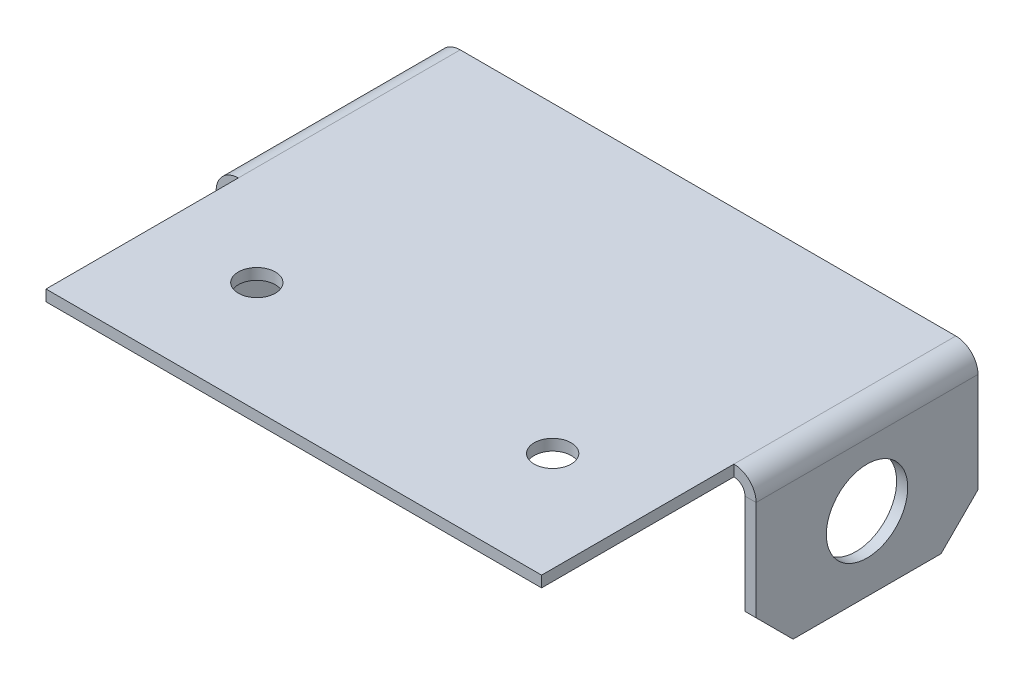
ISO-10303-21;
HEADER;
FILE_DESCRIPTION(('STEP AP214'),'2;1');
FILE_NAME('part.step','',(''),(''),'','','');
FILE_SCHEMA(('AUTOMOTIVE_DESIGN { 1 0 10303 214 1 1 1 1 }'));
ENDSEC;
DATA;
#1=APPLICATION_CONTEXT('core data for automotive mechanical design processes');
#2=APPLICATION_PROTOCOL_DEFINITION('international standard','automotive_design',2000,#1);
#3=PRODUCT_CONTEXT('',#1,'mechanical');
#4=PRODUCT('Part','Part','',(#3));
#5=PRODUCT_RELATED_PRODUCT_CATEGORY('part','',(#4));
#6=PRODUCT_DEFINITION_FORMATION('','',#4);
#7=PRODUCT_DEFINITION_CONTEXT('part definition',#1,'design');
#8=PRODUCT_DEFINITION('design','',#6,#7);
#9=PRODUCT_DEFINITION_SHAPE('','',#8);
#10=(LENGTH_UNIT() NAMED_UNIT(*) SI_UNIT(.MILLI.,.METRE.));
#11=(NAMED_UNIT(*) PLANE_ANGLE_UNIT() SI_UNIT($,.RADIAN.));
#12=(NAMED_UNIT(*) SI_UNIT($,.STERADIAN.) SOLID_ANGLE_UNIT());
#13=UNCERTAINTY_MEASURE_WITH_UNIT(LENGTH_MEASURE(1.E-05),#10,'distance_accuracy_value','');
#14=(GEOMETRIC_REPRESENTATION_CONTEXT(3) GLOBAL_UNCERTAINTY_ASSIGNED_CONTEXT((#13)) GLOBAL_UNIT_ASSIGNED_CONTEXT((#10,
#11,#12)) REPRESENTATION_CONTEXT('',''));
#15=CARTESIAN_POINT('',(0.,0.,0.));
#16=DIRECTION('',(0.,0.,1.));
#17=DIRECTION('',(1.,0.,0.));
#18=AXIS2_PLACEMENT_3D('',#15,#16,#17);
#19=CARTESIAN_POINT('',(33.5,0.,15.));
#20=DIRECTION('',(0.,0.,1.));
#21=DIRECTION('',(1.,0.,0.));
#22=AXIS2_PLACEMENT_3D('',#19,#20,#21);
#23=PLANE('',#22);
#24=DIRECTION('',(0.,1.,0.));
#25=VECTOR('',#24,1.);
#26=CARTESIAN_POINT('',(33.5,0.,15.));
#27=LINE('',#26,#25);
#28=CARTESIAN_POINT('',(33.5,0.,15.));
#29=VERTEX_POINT('',#28);
#30=CARTESIAN_POINT('',(33.5,1.5,15.));
#31=VERTEX_POINT('',#30);
#32=EDGE_CURVE('E313',#29,#31,#27,.T.);
#33=ORIENTED_EDGE('',*,*,#32,.F.);
#34=CARTESIAN_POINT('',(33.5,-1.5,15.));
#35=DIRECTION('',(0.,0.,-1.));
#36=DIRECTION('',(-1.,0.,0.));
#37=AXIS2_PLACEMENT_3D('',#34,#35,#36);
#38=CIRCLE('',#37,1.5);
#39=CARTESIAN_POINT('',(35.,-1.5,15.));
#40=VERTEX_POINT('',#39);
#41=EDGE_CURVE('E227',#40,#29,#38,.F.);
#42=ORIENTED_EDGE('',*,*,#41,.F.);
#43=DIRECTION('',(-1.,0.,0.));
#44=VECTOR('',#43,1.);
#45=CARTESIAN_POINT('',(36.5,-1.5,15.));
#46=LINE('',#45,#44);
#47=CARTESIAN_POINT('',(36.5,-1.5,15.));
#48=VERTEX_POINT('',#47);
#49=EDGE_CURVE('E310',#48,#40,#46,.T.);
#50=ORIENTED_EDGE('',*,*,#49,.F.);
#51=CARTESIAN_POINT('',(33.5,-1.5,15.));
#52=DIRECTION('',(0.,0.,1.));
#53=DIRECTION('',(1.,0.,0.));
#54=AXIS2_PLACEMENT_3D('',#51,#52,#53);
#55=CIRCLE('',#54,3.);
#56=EDGE_CURVE('E234',#48,#31,#55,.T.);
#57=ORIENTED_EDGE('',*,*,#56,.T.);
#58=EDGE_LOOP('',(#33,#42,#50,#57));
#59=FACE_BOUND('',#58,.T.);
#60=ADVANCED_FACE('F43',(#59),#23,.T.);
#61=CARTESIAN_POINT('',(35.,-1.5,-15.));
#62=DIRECTION('',(0.,0.,-1.));
#63=DIRECTION('',(-1.,0.,0.));
#64=AXIS2_PLACEMENT_3D('',#61,#62,#63);
#65=PLANE('',#64);
#66=DIRECTION('',(1.,0.,0.));
#67=VECTOR('',#66,1.);
#68=CARTESIAN_POINT('',(35.,-1.5,-15.));
#69=LINE('',#68,#67);
#70=CARTESIAN_POINT('',(35.,-1.5,-15.));
#71=VERTEX_POINT('',#70);
#72=CARTESIAN_POINT('',(36.5,-1.5,-15.));
#73=VERTEX_POINT('',#72);
#74=EDGE_CURVE('E307',#71,#73,#69,.T.);
#75=ORIENTED_EDGE('',*,*,#74,.F.);
#76=CARTESIAN_POINT('',(33.5,-1.5,-15.));
#77=DIRECTION('',(0.,0.,-1.));
#78=DIRECTION('',(-1.,0.,0.));
#79=AXIS2_PLACEMENT_3D('',#76,#77,#78);
#80=CIRCLE('',#79,1.5);
#81=CARTESIAN_POINT('',(33.5,0.,-15.));
#82=VERTEX_POINT('',#81);
#83=EDGE_CURVE('E251',#71,#82,#80,.F.);
#84=ORIENTED_EDGE('',*,*,#83,.T.);
#85=DIRECTION('',(0.,-1.,0.));
#86=VECTOR('',#85,1.);
#87=CARTESIAN_POINT('',(33.5,1.5,-15.));
#88=LINE('',#87,#86);
#89=CARTESIAN_POINT('',(33.5,1.5,-15.));
#90=VERTEX_POINT('',#89);
#91=EDGE_CURVE('E305',#90,#82,#88,.T.);
#92=ORIENTED_EDGE('',*,*,#91,.F.);
#93=CARTESIAN_POINT('',(33.5,-1.5,-15.));
#94=DIRECTION('',(0.,0.,1.));
#95=DIRECTION('',(1.,0.,0.));
#96=AXIS2_PLACEMENT_3D('',#93,#94,#95);
#97=CIRCLE('',#96,3.);
#98=EDGE_CURVE('E258',#73,#90,#97,.T.);
#99=ORIENTED_EDGE('',*,*,#98,.F.);
#100=EDGE_LOOP('',(#75,#84,#92,#99));
#101=FACE_BOUND('',#100,.T.);
#102=ADVANCED_FACE('F374',(#101),#65,.T.);
#103=CARTESIAN_POINT('',(33.5,1.5,-15.));
#104=DIRECTION('',(0.,0.,-1.));
#105=DIRECTION('',(-1.,0.,0.));
#106=AXIS2_PLACEMENT_3D('',#103,#104,#105);
#107=PLANE('',#106);
#108=DIRECTION('',(0.,1.,0.));
#109=VECTOR('',#108,1.);
#110=CARTESIAN_POINT('',(36.5,0.,-15.));
#111=LINE('',#110,#109);
#112=CARTESIAN_POINT('',(36.5,-15.,-15.));
#113=VERTEX_POINT('',#112);
#114=EDGE_CURVE('E256',#113,#73,#111,.T.);
#115=ORIENTED_EDGE('',*,*,#114,.F.);
#116=DIRECTION('',(-1.,0.,0.));
#117=VECTOR('',#116,1.);
#118=CARTESIAN_POINT('',(33.5,-15.,-15.));
#119=LINE('',#118,#117);
#120=CARTESIAN_POINT('',(35.,-15.,-15.));
#121=VERTEX_POINT('',#120);
#122=EDGE_CURVE('E334',#113,#121,#119,.T.);
#123=ORIENTED_EDGE('',*,*,#122,.T.);
#124=DIRECTION('',(0.,1.,0.));
#125=VECTOR('',#124,1.);
#126=CARTESIAN_POINT('',(35.,0.,-15.));
#127=LINE('',#126,#125);
#128=EDGE_CURVE('E254',#121,#71,#127,.T.);
#129=ORIENTED_EDGE('',*,*,#128,.T.);
#130=ORIENTED_EDGE('',*,*,#74,.T.);
#131=EDGE_LOOP('',(#115,#123,#129,#130));
#132=FACE_BOUND('',#131,.T.);
#133=ADVANCED_FACE('F366',(#132),#107,.T.);
#134=CARTESIAN_POINT('',(-35.,-1.5,15.));
#135=DIRECTION('',(0.,0.,1.));
#136=DIRECTION('',(1.,0.,0.));
#137=AXIS2_PLACEMENT_3D('',#134,#135,#136);
#138=PLANE('',#137);
#139=DIRECTION('',(-1.,0.,0.));
#140=VECTOR('',#139,1.);
#141=CARTESIAN_POINT('',(-35.,-1.5,15.));
#142=LINE('',#141,#140);
#143=CARTESIAN_POINT('',(-35.,-1.5,15.));
#144=VERTEX_POINT('',#143);
#145=CARTESIAN_POINT('',(-36.5,-1.5,15.));
#146=VERTEX_POINT('',#145);
#147=EDGE_CURVE('E303',#144,#146,#142,.T.);
#148=ORIENTED_EDGE('',*,*,#147,.F.);
#149=CARTESIAN_POINT('',(-33.5,-1.5,15.));
#150=DIRECTION('',(0.,0.,-1.));
#151=DIRECTION('',(-1.,0.,0.));
#152=AXIS2_PLACEMENT_3D('',#149,#150,#151);
#153=CIRCLE('',#152,1.5);
#154=CARTESIAN_POINT('',(-33.5,0.,15.));
#155=VERTEX_POINT('',#154);
#156=EDGE_CURVE('E224',#155,#144,#153,.F.);
#157=ORIENTED_EDGE('',*,*,#156,.F.);
#158=DIRECTION('',(0.,-1.,0.));
#159=VECTOR('',#158,1.);
#160=CARTESIAN_POINT('',(-33.5,1.5,15.));
#161=LINE('',#160,#159);
#162=CARTESIAN_POINT('',(-33.5,1.5,15.));
#163=VERTEX_POINT('',#162);
#164=EDGE_CURVE('E183',#163,#155,#161,.T.);
#165=ORIENTED_EDGE('',*,*,#164,.F.);
#166=CARTESIAN_POINT('',(-33.5,-1.5,15.));
#167=DIRECTION('',(0.,0.,1.));
#168=DIRECTION('',(1.,0.,0.));
#169=AXIS2_PLACEMENT_3D('',#166,#167,#168);
#170=CIRCLE('',#169,3.);
#171=EDGE_CURVE('E236',#163,#146,#170,.T.);
#172=ORIENTED_EDGE('',*,*,#171,.T.);
#173=EDGE_LOOP('',(#148,#157,#165,#172));
#174=FACE_BOUND('',#173,.T.);
#175=ADVANCED_FACE('F400',(#174),#138,.T.);
#176=CARTESIAN_POINT('',(-33.5,1.5,15.));
#177=DIRECTION('',(0.,0.,1.));
#178=DIRECTION('',(1.,0.,0.));
#179=AXIS2_PLACEMENT_3D('',#176,#177,#178);
#180=PLANE('',#179);
#181=DIRECTION('',(0.,-1.,0.));
#182=VECTOR('',#181,1.);
#183=CARTESIAN_POINT('',(-36.5,0.,15.));
#184=LINE('',#183,#182);
#185=CARTESIAN_POINT('',(-36.5,-15.,15.));
#186=VERTEX_POINT('',#185);
#187=EDGE_CURVE('E217',#146,#186,#184,.T.);
#188=ORIENTED_EDGE('',*,*,#187,.T.);
#189=DIRECTION('',(1.,0.,0.));
#190=VECTOR('',#189,1.);
#191=CARTESIAN_POINT('',(-33.5,-15.,15.));
#192=LINE('',#191,#190);
#193=CARTESIAN_POINT('',(-35.,-15.,15.));
#194=VERTEX_POINT('',#193);
#195=EDGE_CURVE('E321',#186,#194,#192,.T.);
#196=ORIENTED_EDGE('',*,*,#195,.T.);
#197=DIRECTION('',(0.,-1.,0.));
#198=VECTOR('',#197,1.);
#199=CARTESIAN_POINT('',(-35.,0.,15.));
#200=LINE('',#199,#198);
#201=EDGE_CURVE('E220',#144,#194,#200,.T.);
#202=ORIENTED_EDGE('',*,*,#201,.F.);
#203=ORIENTED_EDGE('',*,*,#147,.T.);
#204=EDGE_LOOP('',(#188,#196,#202,#203));
#205=FACE_BOUND('',#204,.T.);
#206=ADVANCED_FACE('F450',(#205),#180,.T.);
#207=CARTESIAN_POINT('',(-33.5,0.,-15.));
#208=DIRECTION('',(0.,0.,-1.));
#209=DIRECTION('',(-1.,0.,0.));
#210=AXIS2_PLACEMENT_3D('',#207,#208,#209);
#211=PLANE('',#210);
#212=DIRECTION('',(0.,1.,0.));
#213=VECTOR('',#212,1.);
#214=CARTESIAN_POINT('',(-33.5,0.,-15.));
#215=LINE('',#214,#213);
#216=CARTESIAN_POINT('',(-33.5,0.,-15.));
#217=VERTEX_POINT('',#216);
#218=CARTESIAN_POINT('',(-33.5,1.5,-15.));
#219=VERTEX_POINT('',#218);
#220=EDGE_CURVE('E300',#217,#219,#215,.T.);
#221=ORIENTED_EDGE('',*,*,#220,.F.);
#222=CARTESIAN_POINT('',(-33.5,-1.5,-15.));
#223=DIRECTION('',(0.,0.,-1.));
#224=DIRECTION('',(-1.,0.,0.));
#225=AXIS2_PLACEMENT_3D('',#222,#223,#224);
#226=CIRCLE('',#225,1.5);
#227=CARTESIAN_POINT('',(-35.,-1.5,-15.));
#228=VERTEX_POINT('',#227);
#229=EDGE_CURVE('E245',#217,#228,#226,.F.);
#230=ORIENTED_EDGE('',*,*,#229,.T.);
#231=DIRECTION('',(1.,0.,0.));
#232=VECTOR('',#231,1.);
#233=CARTESIAN_POINT('',(-36.5,-1.5,-15.));
#234=LINE('',#233,#232);
#235=CARTESIAN_POINT('',(-36.5,-1.5,-15.));
#236=VERTEX_POINT('',#235);
#237=EDGE_CURVE('E298',#236,#228,#234,.T.);
#238=ORIENTED_EDGE('',*,*,#237,.F.);
#239=CARTESIAN_POINT('',(-33.5,-1.5,-15.));
#240=DIRECTION('',(0.,0.,1.));
#241=DIRECTION('',(1.,0.,0.));
#242=AXIS2_PLACEMENT_3D('',#239,#240,#241);
#243=CIRCLE('',#242,3.);
#244=EDGE_CURVE('E221',#219,#236,#243,.T.);
#245=ORIENTED_EDGE('',*,*,#244,.F.);
#246=EDGE_LOOP('',(#221,#230,#238,#245));
#247=FACE_BOUND('',#246,.T.);
#248=ADVANCED_FACE('F390',(#247),#211,.T.);
#249=CARTESIAN_POINT('',(-36.5,-1.5,-15.));
#250=DIRECTION('',(0.,0.,-1.));
#251=DIRECTION('',(-1.,0.,0.));
#252=AXIS2_PLACEMENT_3D('',#249,#250,#251);
#253=PLANE('',#252);
#254=DIRECTION('',(-1.,0.,0.));
#255=VECTOR('',#254,1.);
#256=CARTESIAN_POINT('',(-35.,0.,-15.));
#257=LINE('',#256,#255);
#258=EDGE_CURVE('E248',#82,#217,#257,.T.);
#259=ORIENTED_EDGE('',*,*,#258,.T.);
#260=ORIENTED_EDGE('',*,*,#220,.T.);
#261=DIRECTION('',(1.,0.,0.));
#262=VECTOR('',#261,1.);
#263=CARTESIAN_POINT('',(-35.,1.5,-15.));
#264=LINE('',#263,#262);
#265=EDGE_CURVE('E261',#90,#219,#264,.F.);
#266=ORIENTED_EDGE('',*,*,#265,.F.);
#267=ORIENTED_EDGE('',*,*,#91,.T.);
#268=EDGE_LOOP('',(#259,#260,#266,#267));
#269=FACE_BOUND('',#268,.T.);
#270=ADVANCED_FACE('F378',(#269),#253,.T.);
#271=CARTESIAN_POINT('',(-36.5,0.,15.));
#272=DIRECTION('',(1.,0.,0.));
#273=DIRECTION('',(0.,1.,0.));
#274=AXIS2_PLACEMENT_3D('',#271,#272,#273);
#275=PLANE('',#274);
#276=CARTESIAN_POINT('',(-36.5,-10.,0.));
#277=DIRECTION('',(-1.,0.,0.));
#278=DIRECTION('',(0.,0.,1.));
#279=AXIS2_PLACEMENT_3D('',#276,#277,#278);
#280=CIRCLE('',#279,5.5);
#281=CARTESIAN_POINT('',(-36.5,-10.,5.5));
#282=VERTEX_POINT('',#281);
#283=EDGE_CURVE('E203',#282,#282,#280,.T.);
#284=ORIENTED_EDGE('',*,*,#283,.F.);
#285=EDGE_LOOP('',(#284));
#286=FACE_BOUND('',#285,.T.);
#287=DIRECTION('',(0.,-1.,0.));
#288=VECTOR('',#287,1.);
#289=CARTESIAN_POINT('',(-36.5,0.,-15.));
#290=LINE('',#289,#288);
#291=CARTESIAN_POINT('',(-36.5,-15.,-15.));
#292=VERTEX_POINT('',#291);
#293=EDGE_CURVE('E216',#236,#292,#290,.T.);
#294=ORIENTED_EDGE('',*,*,#293,.T.);
#295=DIRECTION('',(0.,0.707106781186548,-0.707106781186548));
#296=VECTOR('',#295,1.);
#297=CARTESIAN_POINT('',(-36.5,-15.,-15.));
#298=LINE('',#297,#296);
#299=CARTESIAN_POINT('',(-36.5,-20.,-9.99999999999996));
#300=VERTEX_POINT('',#299);
#301=EDGE_CURVE('E328',#292,#300,#298,.F.);
#302=ORIENTED_EDGE('',*,*,#301,.T.);
#303=DIRECTION('',(0.,0.,-1.));
#304=VECTOR('',#303,1.);
#305=CARTESIAN_POINT('',(-36.5,-20.,15.));
#306=LINE('',#305,#304);
#307=CARTESIAN_POINT('',(-36.5,-20.,9.99999999999996));
#308=VERTEX_POINT('',#307);
#309=EDGE_CURVE('E295',#308,#300,#306,.T.);
#310=ORIENTED_EDGE('',*,*,#309,.F.);
#311=DIRECTION('',(0.,-0.707106781186547,-0.707106781186548));
#312=VECTOR('',#311,1.);
#313=CARTESIAN_POINT('',(-36.5,-20.,9.99999999999996));
#314=LINE('',#313,#312);
#315=EDGE_CURVE('E319',#308,#186,#314,.F.);
#316=ORIENTED_EDGE('',*,*,#315,.T.);
#317=ORIENTED_EDGE('',*,*,#187,.F.);
#318=DIRECTION('',(0.,0.,-1.));
#319=VECTOR('',#318,1.);
#320=CARTESIAN_POINT('',(-36.5,-1.5,15.));
#321=LINE('',#320,#319);
#322=EDGE_CURVE('E239',#146,#236,#321,.T.);
#323=ORIENTED_EDGE('',*,*,#322,.T.);
#324=EDGE_LOOP('',(#294,#302,#310,#316,#317,#323));
#325=FACE_BOUND('',#324,.T.);
#326=ADVANCED_FACE('F446',(#286,#325),#275,.F.);
#327=CARTESIAN_POINT('',(-35.,-20.,15.));
#328=DIRECTION('',(0.,-1.,0.));
#329=DIRECTION('',(0.,0.,-1.));
#330=AXIS2_PLACEMENT_3D('',#327,#328,#329);
#331=PLANE('',#330);
#332=ORIENTED_EDGE('',*,*,#309,.T.);
#333=DIRECTION('',(1.,0.,0.));
#334=VECTOR('',#333,1.);
#335=CARTESIAN_POINT('',(-35.,-20.,-9.99999999999996));
#336=LINE('',#335,#334);
#337=CARTESIAN_POINT('',(-35.,-20.,-9.99999999999996));
#338=VERTEX_POINT('',#337);
#339=EDGE_CURVE('E330',#300,#338,#336,.T.);
#340=ORIENTED_EDGE('',*,*,#339,.T.);
#341=DIRECTION('',(0.,0.,-1.));
#342=VECTOR('',#341,1.);
#343=CARTESIAN_POINT('',(-35.,-20.,15.));
#344=LINE('',#343,#342);
#345=CARTESIAN_POINT('',(-35.,-20.,9.99999999999996));
#346=VERTEX_POINT('',#345);
#347=EDGE_CURVE('E292',#346,#338,#344,.T.);
#348=ORIENTED_EDGE('',*,*,#347,.F.);
#349=DIRECTION('',(-1.,0.,0.));
#350=VECTOR('',#349,1.);
#351=CARTESIAN_POINT('',(-35.,-20.,9.99999999999996));
#352=LINE('',#351,#350);
#353=EDGE_CURVE('E316',#346,#308,#352,.T.);
#354=ORIENTED_EDGE('',*,*,#353,.T.);
#355=EDGE_LOOP('',(#332,#340,#348,#354));
#356=FACE_BOUND('',#355,.T.);
#357=ADVANCED_FACE('F455',(#356),#331,.T.);
#358=CARTESIAN_POINT('',(-35.,0.,15.));
#359=DIRECTION('',(1.,0.,0.));
#360=DIRECTION('',(0.,1.,0.));
#361=AXIS2_PLACEMENT_3D('',#358,#359,#360);
#362=PLANE('',#361);
#363=CARTESIAN_POINT('',(-35.,-10.,0.));
#364=DIRECTION('',(1.,0.,0.));
#365=DIRECTION('',(0.,1.,0.));
#366=AXIS2_PLACEMENT_3D('',#363,#364,#365);
#367=CIRCLE('',#366,5.5);
#368=CARTESIAN_POINT('',(-35.,-4.5,0.));
#369=VERTEX_POINT('',#368);
#370=EDGE_CURVE('E213',#369,#369,#367,.T.);
#371=ORIENTED_EDGE('',*,*,#370,.F.);
#372=EDGE_LOOP('',(#371));
#373=FACE_BOUND('',#372,.T.);
#374=ORIENTED_EDGE('',*,*,#347,.T.);
#375=DIRECTION('',(0.,-0.707106781186548,0.707106781186548));
#376=VECTOR('',#375,1.);
#377=CARTESIAN_POINT('',(-35.,-22.5,-7.49999999999998));
#378=LINE('',#377,#376);
#379=CARTESIAN_POINT('',(-35.,-15.,-15.));
#380=VERTEX_POINT('',#379);
#381=EDGE_CURVE('E332',#338,#380,#378,.F.);
#382=ORIENTED_EDGE('',*,*,#381,.T.);
#383=DIRECTION('',(0.,-1.,0.));
#384=VECTOR('',#383,1.);
#385=CARTESIAN_POINT('',(-35.,0.,-15.));
#386=LINE('',#385,#384);
#387=EDGE_CURVE('E242',#228,#380,#386,.T.);
#388=ORIENTED_EDGE('',*,*,#387,.F.);
#389=DIRECTION('',(0.,0.,-1.));
#390=VECTOR('',#389,1.);
#391=CARTESIAN_POINT('',(-35.,-1.5,15.));
#392=LINE('',#391,#390);
#393=EDGE_CURVE('E289',#144,#228,#392,.T.);
#394=ORIENTED_EDGE('',*,*,#393,.F.);
#395=ORIENTED_EDGE('',*,*,#201,.T.);
#396=DIRECTION('',(0.,0.707106781186547,0.707106781186548));
#397=VECTOR('',#396,1.);
#398=CARTESIAN_POINT('',(-35.,-7.49999999999999,22.5));
#399=LINE('',#398,#397);
#400=EDGE_CURVE('E323',#194,#346,#399,.F.);
#401=ORIENTED_EDGE('',*,*,#400,.T.);
#402=EDGE_LOOP('',(#374,#382,#388,#394,#395,#401));
#403=FACE_BOUND('',#402,.T.);
#404=ADVANCED_FACE('F441',(#373,#403),#362,.T.);
#405=CARTESIAN_POINT('',(-33.5,-1.5,15.));
#406=DIRECTION('',(0.,0.,-1.));
#407=DIRECTION('',(-1.,0.,0.));
#408=AXIS2_PLACEMENT_3D('',#405,#406,#407);
#409=CYLINDRICAL_SURFACE('',#408,1.5);
#410=ORIENTED_EDGE('',*,*,#229,.F.);
#411=DIRECTION('',(0.,0.,-1.));
#412=VECTOR('',#411,1.);
#413=CARTESIAN_POINT('',(-33.5,0.,15.));
#414=LINE('',#413,#412);
#415=EDGE_CURVE('E287',#155,#217,#414,.T.);
#416=ORIENTED_EDGE('',*,*,#415,.F.);
#417=ORIENTED_EDGE('',*,*,#156,.T.);
#418=ORIENTED_EDGE('',*,*,#393,.T.);
#419=EDGE_LOOP('',(#410,#416,#417,#418));
#420=FACE_BOUND('',#419,.T.);
#421=ADVANCED_FACE('F386',(#420),#409,.F.);
#422=CARTESIAN_POINT('',(-35.,0.,15.));
#423=DIRECTION('',(0.,-1.,0.));
#424=DIRECTION('',(0.,0.,-1.));
#425=AXIS2_PLACEMENT_3D('',#422,#423,#424);
#426=PLANE('',#425);
#427=CARTESIAN_POINT('',(-20.,0.,26.));
#428=DIRECTION('',(0.,1.,0.));
#429=DIRECTION('',(0.,0.,1.));
#430=AXIS2_PLACEMENT_3D('',#427,#428,#429);
#431=CIRCLE('',#430,2.5);
#432=CARTESIAN_POINT('',(-20.,0.,28.5));
#433=VERTEX_POINT('',#432);
#434=EDGE_CURVE('E200',#433,#433,#431,.T.);
#435=ORIENTED_EDGE('',*,*,#434,.T.);
#436=EDGE_LOOP('',(#435));
#437=FACE_BOUND('',#436,.T.);
#438=CARTESIAN_POINT('',(20.,0.,26.));
#439=DIRECTION('',(0.,1.,0.));
#440=DIRECTION('',(0.,0.,-1.));
#441=AXIS2_PLACEMENT_3D('',#438,#439,#440);
#442=CIRCLE('',#441,2.5);
#443=CARTESIAN_POINT('',(20.,0.,23.5));
#444=VERTEX_POINT('',#443);
#445=EDGE_CURVE('E732',#444,#444,#442,.T.);
#446=ORIENTED_EDGE('',*,*,#445,.T.);
#447=EDGE_LOOP('',(#446));
#448=FACE_BOUND('',#447,.T.);
#449=ORIENTED_EDGE('',*,*,#258,.F.);
#450=DIRECTION('',(0.,0.,-1.));
#451=VECTOR('',#450,1.);
#452=CARTESIAN_POINT('',(33.5,0.,15.));
#453=LINE('',#452,#451);
#454=EDGE_CURVE('E284',#29,#82,#453,.T.);
#455=ORIENTED_EDGE('',*,*,#454,.F.);
#456=DIRECTION('',(0.,0.,-1.));
#457=VECTOR('',#456,1.);
#458=CARTESIAN_POINT('',(33.5,0.,15.));
#459=LINE('',#458,#457);
#460=CARTESIAN_POINT('',(33.5,0.,41.));
#461=VERTEX_POINT('',#460);
#462=EDGE_CURVE('E186',#461,#29,#459,.T.);
#463=ORIENTED_EDGE('',*,*,#462,.F.);
#464=DIRECTION('',(1.,0.,0.));
#465=VECTOR('',#464,1.);
#466=CARTESIAN_POINT('',(33.5,0.,41.));
#467=LINE('',#466,#465);
#468=CARTESIAN_POINT('',(-33.5,0.,41.));
#469=VERTEX_POINT('',#468);
#470=EDGE_CURVE('E170',#469,#461,#467,.T.);
#471=ORIENTED_EDGE('',*,*,#470,.F.);
#472=DIRECTION('',(0.,0.,1.));
#473=VECTOR('',#472,1.);
#474=CARTESIAN_POINT('',(-33.5,0.,15.));
#475=LINE('',#474,#473);
#476=EDGE_CURVE('E180',#155,#469,#475,.T.);
#477=ORIENTED_EDGE('',*,*,#476,.F.);
#478=ORIENTED_EDGE('',*,*,#415,.T.);
#479=EDGE_LOOP('',(#449,#455,#463,#471,#477,#478));
#480=FACE_BOUND('',#479,.T.);
#481=ADVANCED_FACE('F190',(#437,#448,#480),#426,.T.);
#482=CARTESIAN_POINT('',(33.5,-1.5,15.));
#483=DIRECTION('',(0.,0.,-1.));
#484=DIRECTION('',(-1.,0.,0.));
#485=AXIS2_PLACEMENT_3D('',#482,#483,#484);
#486=CYLINDRICAL_SURFACE('',#485,1.5);
#487=ORIENTED_EDGE('',*,*,#83,.F.);
#488=DIRECTION('',(0.,0.,-1.));
#489=VECTOR('',#488,1.);
#490=CARTESIAN_POINT('',(35.,-1.5,15.));
#491=LINE('',#490,#489);
#492=EDGE_CURVE('E281',#40,#71,#491,.T.);
#493=ORIENTED_EDGE('',*,*,#492,.F.);
#494=ORIENTED_EDGE('',*,*,#41,.T.);
#495=ORIENTED_EDGE('',*,*,#454,.T.);
#496=EDGE_LOOP('',(#487,#493,#494,#495));
#497=FACE_BOUND('',#496,.T.);
#498=ADVANCED_FACE('F380',(#497),#486,.F.);
#499=CARTESIAN_POINT('',(35.,0.,15.));
#500=DIRECTION('',(-1.,0.,0.));
#501=DIRECTION('',(0.,-1.,0.));
#502=AXIS2_PLACEMENT_3D('',#499,#500,#501);
#503=PLANE('',#502);
#504=CARTESIAN_POINT('',(35.,-10.,0.));
#505=DIRECTION('',(-1.,0.,0.));
#506=DIRECTION('',(0.,-1.,0.));
#507=AXIS2_PLACEMENT_3D('',#504,#505,#506);
#508=CIRCLE('',#507,5.5);
#509=CARTESIAN_POINT('',(35.,-15.5,0.));
#510=VERTEX_POINT('',#509);
#511=EDGE_CURVE('E208',#510,#510,#508,.T.);
#512=ORIENTED_EDGE('',*,*,#511,.F.);
#513=EDGE_LOOP('',(#512));
#514=FACE_BOUND('',#513,.T.);
#515=DIRECTION('',(0.,0.,-1.));
#516=VECTOR('',#515,1.);
#517=CARTESIAN_POINT('',(35.,-20.,15.));
#518=LINE('',#517,#516);
#519=CARTESIAN_POINT('',(35.,-20.,9.99999999999996));
#520=VERTEX_POINT('',#519);
#521=CARTESIAN_POINT('',(35.,-20.,-9.99999999999996));
#522=VERTEX_POINT('',#521);
#523=EDGE_CURVE('E279',#520,#522,#518,.T.);
#524=ORIENTED_EDGE('',*,*,#523,.F.);
#525=DIRECTION('',(0.,0.707106781186548,0.707106781186548));
#526=VECTOR('',#525,1.);
#527=CARTESIAN_POINT('',(35.,-7.49999999999998,22.5));
#528=LINE('',#527,#526);
#529=CARTESIAN_POINT('',(35.,-15.,15.));
#530=VERTEX_POINT('',#529);
#531=EDGE_CURVE('E65',#520,#530,#528,.T.);
#532=ORIENTED_EDGE('',*,*,#531,.T.);
#533=DIRECTION('',(0.,1.,0.));
#534=VECTOR('',#533,1.);
#535=CARTESIAN_POINT('',(35.,0.,15.));
#536=LINE('',#535,#534);
#537=EDGE_CURVE('E230',#530,#40,#536,.T.);
#538=ORIENTED_EDGE('',*,*,#537,.T.);
#539=ORIENTED_EDGE('',*,*,#492,.T.);
#540=ORIENTED_EDGE('',*,*,#128,.F.);
#541=DIRECTION('',(0.,0.707106781186547,-0.707106781186548));
#542=VECTOR('',#541,1.);
#543=CARTESIAN_POINT('',(35.,-22.5,-7.49999999999998));
#544=LINE('',#543,#542);
#545=EDGE_CURVE('E337',#121,#522,#544,.F.);
#546=ORIENTED_EDGE('',*,*,#545,.T.);
#547=EDGE_LOOP('',(#524,#532,#538,#539,#540,#546));
#548=FACE_BOUND('',#547,.T.);
#549=ADVANCED_FACE('F354',(#514,#548),#503,.T.);
#550=CARTESIAN_POINT('',(36.5,-20.,15.));
#551=DIRECTION('',(0.,-1.,0.));
#552=DIRECTION('',(0.,0.,-1.));
#553=AXIS2_PLACEMENT_3D('',#550,#551,#552);
#554=PLANE('',#553);
#555=DIRECTION('',(0.,0.,-1.));
#556=VECTOR('',#555,1.);
#557=CARTESIAN_POINT('',(36.5,-20.,15.));
#558=LINE('',#557,#556);
#559=CARTESIAN_POINT('',(36.5,-20.,9.99999999999996));
#560=VERTEX_POINT('',#559);
#561=CARTESIAN_POINT('',(36.5,-20.,-9.99999999999996));
#562=VERTEX_POINT('',#561);
#563=EDGE_CURVE('E277',#560,#562,#558,.T.);
#564=ORIENTED_EDGE('',*,*,#563,.F.);
#565=DIRECTION('',(-1.,0.,0.));
#566=VECTOR('',#565,1.);
#567=CARTESIAN_POINT('',(35.,-20.,9.99999999999996));
#568=LINE('',#567,#566);
#569=EDGE_CURVE('E345',#560,#520,#568,.T.);
#570=ORIENTED_EDGE('',*,*,#569,.T.);
#571=ORIENTED_EDGE('',*,*,#523,.T.);
#572=DIRECTION('',(1.,0.,0.));
#573=VECTOR('',#572,1.);
#574=CARTESIAN_POINT('',(36.5,-20.,-9.99999999999996));
#575=LINE('',#574,#573);
#576=EDGE_CURVE('E340',#522,#562,#575,.T.);
#577=ORIENTED_EDGE('',*,*,#576,.T.);
#578=EDGE_LOOP('',(#564,#570,#571,#577));
#579=FACE_BOUND('',#578,.T.);
#580=ADVANCED_FACE('F351',(#579),#554,.T.);
#581=CARTESIAN_POINT('',(36.5,0.,15.));
#582=DIRECTION('',(-1.,0.,0.));
#583=DIRECTION('',(0.,-1.,0.));
#584=AXIS2_PLACEMENT_3D('',#581,#582,#583);
#585=PLANE('',#584);
#586=CARTESIAN_POINT('',(36.5,-10.,0.));
#587=DIRECTION('',(-1.,0.,0.));
#588=DIRECTION('',(0.,0.,1.));
#589=AXIS2_PLACEMENT_3D('',#586,#587,#588);
#590=CIRCLE('',#589,5.5);
#591=CARTESIAN_POINT('',(36.5,-10.,5.5));
#592=VERTEX_POINT('',#591);
#593=EDGE_CURVE('E205',#592,#592,#590,.T.);
#594=ORIENTED_EDGE('',*,*,#593,.T.);
#595=EDGE_LOOP('',(#594));
#596=FACE_BOUND('',#595,.T.);
#597=DIRECTION('',(0.,1.,0.));
#598=VECTOR('',#597,1.);
#599=CARTESIAN_POINT('',(36.5,0.,15.));
#600=LINE('',#599,#598);
#601=CARTESIAN_POINT('',(36.5,-15.,15.));
#602=VERTEX_POINT('',#601);
#603=EDGE_CURVE('E232',#602,#48,#600,.T.);
#604=ORIENTED_EDGE('',*,*,#603,.F.);
#605=DIRECTION('',(0.,-0.707106781186548,-0.707106781186548));
#606=VECTOR('',#605,1.);
#607=CARTESIAN_POINT('',(36.5,-20.,9.99999999999996));
#608=LINE('',#607,#606);
#609=EDGE_CURVE('E11',#602,#560,#608,.T.);
#610=ORIENTED_EDGE('',*,*,#609,.T.);
#611=ORIENTED_EDGE('',*,*,#563,.T.);
#612=DIRECTION('',(0.,-0.707106781186547,0.707106781186548));
#613=VECTOR('',#612,1.);
#614=CARTESIAN_POINT('',(36.5,-15.,-15.));
#615=LINE('',#614,#613);
#616=EDGE_CURVE('E343',#562,#113,#615,.F.);
#617=ORIENTED_EDGE('',*,*,#616,.T.);
#618=ORIENTED_EDGE('',*,*,#114,.T.);
#619=DIRECTION('',(0.,0.,-1.));
#620=VECTOR('',#619,1.);
#621=CARTESIAN_POINT('',(36.5,-1.5,15.));
#622=LINE('',#621,#620);
#623=EDGE_CURVE('E274',#48,#73,#622,.T.);
#624=ORIENTED_EDGE('',*,*,#623,.F.);
#625=EDGE_LOOP('',(#604,#610,#611,#617,#618,#624));
#626=FACE_BOUND('',#625,.T.);
#627=ADVANCED_FACE('F363',(#596,#626),#585,.F.);
#628=CARTESIAN_POINT('',(33.5,-1.5,15.));
#629=DIRECTION('',(0.,0.,-1.));
#630=DIRECTION('',(-1.,0.,0.));
#631=AXIS2_PLACEMENT_3D('',#628,#629,#630);
#632=CYLINDRICAL_SURFACE('',#631,3.);
#633=ORIENTED_EDGE('',*,*,#98,.T.);
#634=DIRECTION('',(0.,0.,-1.));
#635=VECTOR('',#634,1.);
#636=CARTESIAN_POINT('',(33.5,1.5,15.));
#637=LINE('',#636,#635);
#638=EDGE_CURVE('E271',#31,#90,#637,.T.);
#639=ORIENTED_EDGE('',*,*,#638,.F.);
#640=ORIENTED_EDGE('',*,*,#56,.F.);
#641=ORIENTED_EDGE('',*,*,#623,.T.);
#642=EDGE_LOOP('',(#633,#639,#640,#641));
#643=FACE_BOUND('',#642,.T.);
#644=ADVANCED_FACE('F372',(#643),#632,.T.);
#645=CARTESIAN_POINT('',(-35.,1.5,15.));
#646=DIRECTION('',(0.,-1.,0.));
#647=DIRECTION('',(0.,0.,-1.));
#648=AXIS2_PLACEMENT_3D('',#645,#646,#647);
#649=PLANE('',#648);
#650=CARTESIAN_POINT('',(-20.,1.5,26.));
#651=DIRECTION('',(0.,1.,0.));
#652=DIRECTION('',(0.,0.,1.));
#653=AXIS2_PLACEMENT_3D('',#650,#651,#652);
#654=CIRCLE('',#653,2.5);
#655=CARTESIAN_POINT('',(-20.,1.5,28.5));
#656=VERTEX_POINT('',#655);
#657=EDGE_CURVE('E731',#656,#656,#654,.T.);
#658=ORIENTED_EDGE('',*,*,#657,.F.);
#659=EDGE_LOOP('',(#658));
#660=FACE_BOUND('',#659,.T.);
#661=CARTESIAN_POINT('',(20.,1.5,26.));
#662=DIRECTION('',(0.,1.,0.));
#663=DIRECTION('',(0.,0.,-1.));
#664=AXIS2_PLACEMENT_3D('',#661,#662,#663);
#665=CIRCLE('',#664,2.5);
#666=CARTESIAN_POINT('',(20.,1.5,23.5));
#667=VERTEX_POINT('',#666);
#668=EDGE_CURVE('E736',#667,#667,#665,.T.);
#669=ORIENTED_EDGE('',*,*,#668,.F.);
#670=EDGE_LOOP('',(#669));
#671=FACE_BOUND('',#670,.T.);
#672=ORIENTED_EDGE('',*,*,#265,.T.);
#673=DIRECTION('',(0.,0.,-1.));
#674=VECTOR('',#673,1.);
#675=CARTESIAN_POINT('',(-33.5,1.5,15.));
#676=LINE('',#675,#674);
#677=EDGE_CURVE('E268',#163,#219,#676,.T.);
#678=ORIENTED_EDGE('',*,*,#677,.F.);
#679=DIRECTION('',(0.,0.,1.));
#680=VECTOR('',#679,1.);
#681=CARTESIAN_POINT('',(-33.5,1.5,15.));
#682=LINE('',#681,#680);
#683=CARTESIAN_POINT('',(-33.5,1.5,41.));
#684=VERTEX_POINT('',#683);
#685=EDGE_CURVE('E199',#163,#684,#682,.T.);
#686=ORIENTED_EDGE('',*,*,#685,.T.);
#687=DIRECTION('',(1.,0.,0.));
#688=VECTOR('',#687,1.);
#689=CARTESIAN_POINT('',(33.5,1.5,41.));
#690=LINE('',#689,#688);
#691=CARTESIAN_POINT('',(33.5,1.5,41.));
#692=VERTEX_POINT('',#691);
#693=EDGE_CURVE('E172',#684,#692,#690,.T.);
#694=ORIENTED_EDGE('',*,*,#693,.T.);
#695=DIRECTION('',(0.,0.,-1.));
#696=VECTOR('',#695,1.);
#697=CARTESIAN_POINT('',(33.5,1.5,15.));
#698=LINE('',#697,#696);
#699=EDGE_CURVE('E196',#692,#31,#698,.T.);
#700=ORIENTED_EDGE('',*,*,#699,.T.);
#701=ORIENTED_EDGE('',*,*,#638,.T.);
#702=EDGE_LOOP('',(#672,#678,#686,#694,#700,#701));
#703=FACE_BOUND('',#702,.T.);
#704=ADVANCED_FACE('F394',(#660,#671,#703),#649,.F.);
#705=CARTESIAN_POINT('',(-33.5,-1.5,15.));
#706=DIRECTION('',(0.,0.,-1.));
#707=DIRECTION('',(-1.,0.,0.));
#708=AXIS2_PLACEMENT_3D('',#705,#706,#707);
#709=CYLINDRICAL_SURFACE('',#708,3.);
#710=ORIENTED_EDGE('',*,*,#244,.T.);
#711=ORIENTED_EDGE('',*,*,#322,.F.);
#712=ORIENTED_EDGE('',*,*,#171,.F.);
#713=ORIENTED_EDGE('',*,*,#677,.T.);
#714=EDGE_LOOP('',(#710,#711,#712,#713));
#715=FACE_BOUND('',#714,.T.);
#716=ADVANCED_FACE('F396',(#715),#709,.T.);
#717=CARTESIAN_POINT('',(-33.5,-1.5,15.));
#718=DIRECTION('',(0.,0.,-1.));
#719=DIRECTION('',(-1.,0.,0.));
#720=AXIS2_PLACEMENT_3D('',#717,#718,#719);
#721=PLANE('',#720);
#722=ORIENTED_EDGE('',*,*,#537,.F.);
#723=DIRECTION('',(1.,0.,0.));
#724=VECTOR('',#723,1.);
#725=CARTESIAN_POINT('',(36.5,-15.,15.));
#726=LINE('',#725,#724);
#727=EDGE_CURVE('E51',#530,#602,#726,.T.);
#728=ORIENTED_EDGE('',*,*,#727,.T.);
#729=ORIENTED_EDGE('',*,*,#603,.T.);
#730=ORIENTED_EDGE('',*,*,#49,.T.);
#731=EDGE_LOOP('',(#722,#728,#729,#730));
#732=FACE_BOUND('',#731,.T.);
#733=ADVANCED_FACE('F406',(#732),#721,.F.);
#734=CARTESIAN_POINT('',(-33.5,-1.5,-15.));
#735=DIRECTION('',(0.,0.,-1.));
#736=DIRECTION('',(-1.,0.,0.));
#737=AXIS2_PLACEMENT_3D('',#734,#735,#736);
#738=PLANE('',#737);
#739=ORIENTED_EDGE('',*,*,#387,.T.);
#740=DIRECTION('',(-1.,0.,0.));
#741=VECTOR('',#740,1.);
#742=CARTESIAN_POINT('',(-33.5,-15.,-15.));
#743=LINE('',#742,#741);
#744=EDGE_CURVE('E325',#380,#292,#743,.T.);
#745=ORIENTED_EDGE('',*,*,#744,.T.);
#746=ORIENTED_EDGE('',*,*,#293,.F.);
#747=ORIENTED_EDGE('',*,*,#237,.T.);
#748=EDGE_LOOP('',(#739,#745,#746,#747));
#749=FACE_BOUND('',#748,.T.);
#750=ADVANCED_FACE('F431',(#749),#738,.T.);
#751=CARTESIAN_POINT('',(-35.,-20.,9.99999999999996));
#752=DIRECTION('',(0.,0.707106781186548,-0.707106781186547));
#753=DIRECTION('',(-1.,0.,0.));
#754=AXIS2_PLACEMENT_3D('',#751,#752,#753);
#755=PLANE('',#754);
#756=ORIENTED_EDGE('',*,*,#400,.F.);
#757=ORIENTED_EDGE('',*,*,#195,.F.);
#758=ORIENTED_EDGE('',*,*,#315,.F.);
#759=ORIENTED_EDGE('',*,*,#353,.F.);
#760=EDGE_LOOP('',(#756,#757,#758,#759));
#761=FACE_BOUND('',#760,.T.);
#762=ADVANCED_FACE('F428',(#761),#755,.F.);
#763=CARTESIAN_POINT('',(-33.5,-15.,-15.));
#764=DIRECTION('',(0.,0.707106781186547,0.707106781186547));
#765=DIRECTION('',(-1.,0.,0.));
#766=AXIS2_PLACEMENT_3D('',#763,#764,#765);
#767=PLANE('',#766);
#768=ORIENTED_EDGE('',*,*,#381,.F.);
#769=ORIENTED_EDGE('',*,*,#339,.F.);
#770=ORIENTED_EDGE('',*,*,#301,.F.);
#771=ORIENTED_EDGE('',*,*,#744,.F.);
#772=EDGE_LOOP('',(#768,#769,#770,#771));
#773=FACE_BOUND('',#772,.T.);
#774=ADVANCED_FACE('F417',(#773),#767,.F.);
#775=CARTESIAN_POINT('',(33.5,-15.,-15.));
#776=DIRECTION('',(0.,0.707106781186548,0.707106781186547));
#777=DIRECTION('',(-1.,0.,0.));
#778=AXIS2_PLACEMENT_3D('',#775,#776,#777);
#779=PLANE('',#778);
#780=ORIENTED_EDGE('',*,*,#616,.F.);
#781=ORIENTED_EDGE('',*,*,#576,.F.);
#782=ORIENTED_EDGE('',*,*,#545,.F.);
#783=ORIENTED_EDGE('',*,*,#122,.F.);
#784=EDGE_LOOP('',(#780,#781,#782,#783));
#785=FACE_BOUND('',#784,.T.);
#786=ADVANCED_FACE('F360',(#785),#779,.F.);
#787=CARTESIAN_POINT('',(36.5,-20.,9.99999999999996));
#788=DIRECTION('',(0.,-0.707106781186547,0.707106781186547));
#789=DIRECTION('',(1.,0.,0.));
#790=AXIS2_PLACEMENT_3D('',#787,#788,#789);
#791=PLANE('',#790);
#792=ORIENTED_EDGE('',*,*,#609,.F.);
#793=ORIENTED_EDGE('',*,*,#727,.F.);
#794=ORIENTED_EDGE('',*,*,#531,.F.);
#795=ORIENTED_EDGE('',*,*,#569,.F.);
#796=EDGE_LOOP('',(#792,#793,#794,#795));
#797=FACE_BOUND('',#796,.T.);
#798=ADVANCED_FACE('F45',(#797),#791,.T.);
#799=CARTESIAN_POINT('',(36.5,-10.,0.));
#800=DIRECTION('',(-1.,0.,0.));
#801=DIRECTION('',(0.,0.,1.));
#802=AXIS2_PLACEMENT_3D('',#799,#800,#801);
#803=CYLINDRICAL_SURFACE('',#802,5.5);
#804=ORIENTED_EDGE('',*,*,#511,.T.);
#805=EDGE_LOOP('',(#804));
#806=FACE_BOUND('',#805,.T.);
#807=ORIENTED_EDGE('',*,*,#593,.F.);
#808=EDGE_LOOP('',(#807));
#809=FACE_BOUND('',#808,.T.);
#810=ADVANCED_FACE('F408',(#806,#809),#803,.F.);
#811=ORIENTED_EDGE('',*,*,#370,.T.);
#812=EDGE_LOOP('',(#811));
#813=FACE_BOUND('',#812,.T.);
#814=ORIENTED_EDGE('',*,*,#283,.T.);
#815=EDGE_LOOP('',(#814));
#816=FACE_BOUND('',#815,.T.);
#817=ADVANCED_FACE('F414',(#813,#816),#803,.F.);
#818=CARTESIAN_POINT('',(33.5,0.,15.));
#819=DIRECTION('',(1.,0.,0.));
#820=DIRECTION('',(0.,0.,-1.));
#821=AXIS2_PLACEMENT_3D('',#818,#819,#820);
#822=PLANE('',#821);
#823=ORIENTED_EDGE('',*,*,#699,.F.);
#824=DIRECTION('',(0.,1.,0.));
#825=VECTOR('',#824,1.);
#826=CARTESIAN_POINT('',(33.5,0.,41.));
#827=LINE('',#826,#825);
#828=EDGE_CURVE('E176',#461,#692,#827,.T.);
#829=ORIENTED_EDGE('',*,*,#828,.F.);
#830=ORIENTED_EDGE('',*,*,#462,.T.);
#831=ORIENTED_EDGE('',*,*,#32,.T.);
#832=EDGE_LOOP('',(#823,#829,#830,#831));
#833=FACE_BOUND('',#832,.T.);
#834=ADVANCED_FACE('F403',(#833),#822,.T.);
#835=CARTESIAN_POINT('',(33.5,0.,41.));
#836=DIRECTION('',(0.,0.,1.));
#837=DIRECTION('',(1.,0.,0.));
#838=AXIS2_PLACEMENT_3D('',#835,#836,#837);
#839=PLANE('',#838);
#840=ORIENTED_EDGE('',*,*,#693,.F.);
#841=DIRECTION('',(0.,1.,0.));
#842=VECTOR('',#841,1.);
#843=CARTESIAN_POINT('',(-33.5,0.,41.));
#844=LINE('',#843,#842);
#845=EDGE_CURVE('E166',#469,#684,#844,.T.);
#846=ORIENTED_EDGE('',*,*,#845,.F.);
#847=ORIENTED_EDGE('',*,*,#470,.T.);
#848=ORIENTED_EDGE('',*,*,#828,.T.);
#849=EDGE_LOOP('',(#840,#846,#847,#848));
#850=FACE_BOUND('',#849,.T.);
#851=ADVANCED_FACE('F168',(#850),#839,.T.);
#852=CARTESIAN_POINT('',(-33.5,0.,15.));
#853=DIRECTION('',(-1.,0.,0.));
#854=DIRECTION('',(0.,0.,1.));
#855=AXIS2_PLACEMENT_3D('',#852,#853,#854);
#856=PLANE('',#855);
#857=ORIENTED_EDGE('',*,*,#685,.F.);
#858=ORIENTED_EDGE('',*,*,#164,.T.);
#859=ORIENTED_EDGE('',*,*,#476,.T.);
#860=ORIENTED_EDGE('',*,*,#845,.T.);
#861=EDGE_LOOP('',(#857,#858,#859,#860));
#862=FACE_BOUND('',#861,.T.);
#863=ADVANCED_FACE('F181',(#862),#856,.T.);
#864=CARTESIAN_POINT('',(20.,0.,26.));
#865=DIRECTION('',(0.,1.,0.));
#866=DIRECTION('',(0.,0.,1.));
#867=AXIS2_PLACEMENT_3D('',#864,#865,#866);
#868=CYLINDRICAL_SURFACE('',#867,2.5);
#869=ORIENTED_EDGE('',*,*,#445,.F.);
#870=EDGE_LOOP('',(#869));
#871=FACE_BOUND('',#870,.T.);
#872=ORIENTED_EDGE('',*,*,#668,.T.);
#873=EDGE_LOOP('',(#872));
#874=FACE_BOUND('',#873,.T.);
#875=ADVANCED_FACE('F694',(#871,#874),#868,.F.);
#876=CARTESIAN_POINT('',(-20.,0.,26.));
#877=DIRECTION('',(0.,1.,0.));
#878=DIRECTION('',(0.,0.,1.));
#879=AXIS2_PLACEMENT_3D('',#876,#877,#878);
#880=CYLINDRICAL_SURFACE('',#879,2.5);
#881=ORIENTED_EDGE('',*,*,#434,.F.);
#882=EDGE_LOOP('',(#881));
#883=FACE_BOUND('',#882,.T.);
#884=ORIENTED_EDGE('',*,*,#657,.T.);
#885=EDGE_LOOP('',(#884));
#886=FACE_BOUND('',#885,.T.);
#887=ADVANCED_FACE('F704',(#883,#886),#880,.F.);
#888=CLOSED_SHELL('',(#60,#102,#133,#175,#206,#248,#270,#326,#357,#404,#421,#481,#498,#549,#580,
#627,#644,#704,#716,#733,#750,#762,#774,#786,#798,#810,#817,#834,#851,#863,#875,#887));
#889=MANIFOLD_SOLID_BREP('B2',#888);
#890=ADVANCED_BREP_SHAPE_REPRESENTATION('',(#18,#889),#14);
#891=SHAPE_DEFINITION_REPRESENTATION(#9,#890);
ENDSEC;
END-ISO-10303-21;
